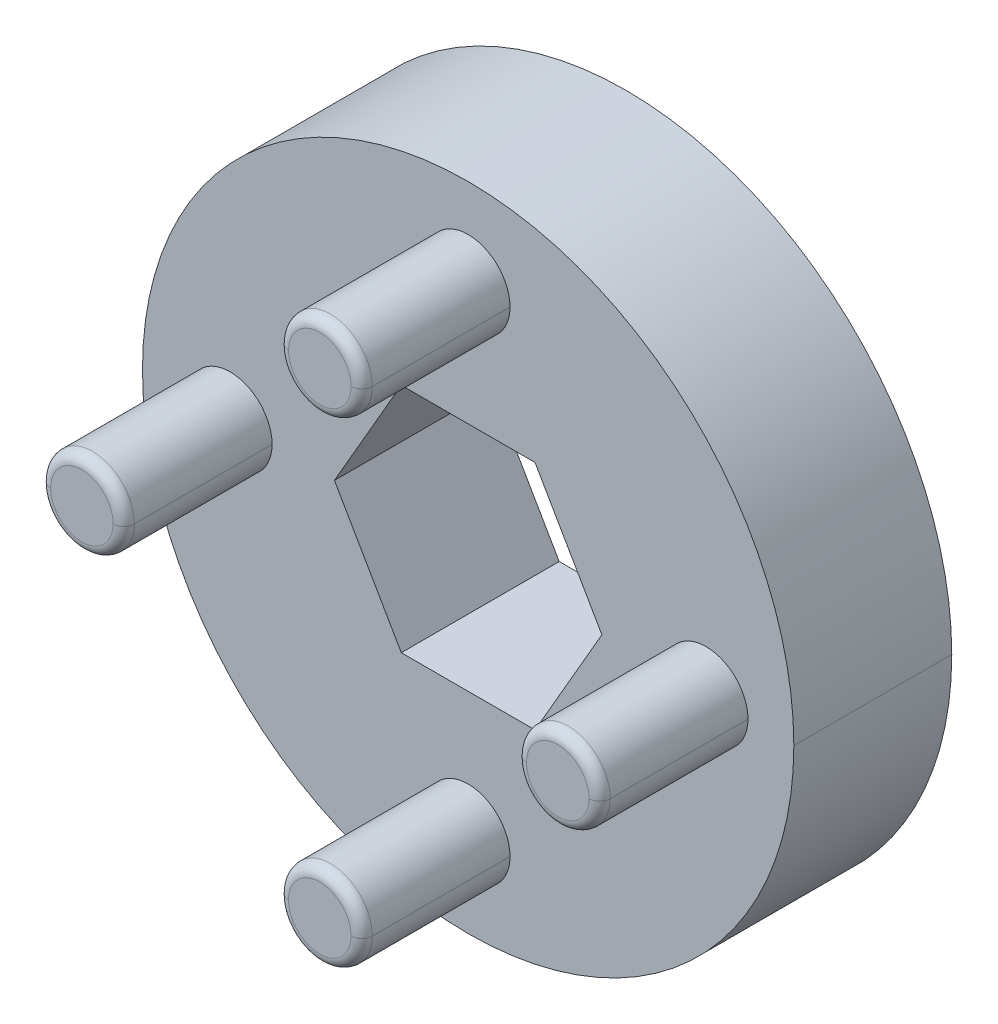
ISO-10303-21;
HEADER;
FILE_DESCRIPTION(('STEP AP214'),'2;1');
FILE_NAME('part.step','',(''),(''),'','','');
FILE_SCHEMA(('AUTOMOTIVE_DESIGN { 1 0 10303 214 1 1 1 1 }'));
ENDSEC;
DATA;
#1=APPLICATION_CONTEXT('core data for automotive mechanical design processes');
#2=APPLICATION_PROTOCOL_DEFINITION('international standard','automotive_design',2000,#1);
#3=PRODUCT_CONTEXT('',#1,'mechanical');
#4=PRODUCT('Part','Part','',(#3));
#5=PRODUCT_RELATED_PRODUCT_CATEGORY('part','',(#4));
#6=PRODUCT_DEFINITION_FORMATION('','',#4);
#7=PRODUCT_DEFINITION_CONTEXT('part definition',#1,'design');
#8=PRODUCT_DEFINITION('design','',#6,#7);
#9=PRODUCT_DEFINITION_SHAPE('','',#8);
#10=(LENGTH_UNIT() NAMED_UNIT(*) SI_UNIT(.MILLI.,.METRE.));
#11=(NAMED_UNIT(*) PLANE_ANGLE_UNIT() SI_UNIT($,.RADIAN.));
#12=(NAMED_UNIT(*) SI_UNIT($,.STERADIAN.) SOLID_ANGLE_UNIT());
#13=UNCERTAINTY_MEASURE_WITH_UNIT(LENGTH_MEASURE(1.E-05),#10,'distance_accuracy_value','');
#14=(GEOMETRIC_REPRESENTATION_CONTEXT(3) GLOBAL_UNCERTAINTY_ASSIGNED_CONTEXT((#13)) GLOBAL_UNIT_ASSIGNED_CONTEXT((#10,
#11,#12)) REPRESENTATION_CONTEXT('',''));
#15=CARTESIAN_POINT('',(0.,0.,0.));
#16=DIRECTION('',(0.,0.,1.));
#17=DIRECTION('',(1.,0.,0.));
#18=AXIS2_PLACEMENT_3D('',#15,#16,#17);
#19=CARTESIAN_POINT('',(-11.3665,1.19057767913881E-13,14.1224));
#20=DIRECTION('',(0.,0.,1.));
#21=DIRECTION('',(1.,0.,0.));
#22=AXIS2_PLACEMENT_3D('',#19,#20,#21);
#23=TOROIDAL_SURFACE('',#22,1.49225,0.508);
#24=CARTESIAN_POINT('',(-11.3665,1.19057767913881E-13,14.1224));
#25=DIRECTION('',(0.,0.,-1.));
#26=DIRECTION('',(1.,0.,0.));
#27=AXIS2_PLACEMENT_3D('',#24,#25,#26);
#28=CIRCLE('',#27,2.00025);
#29=CARTESIAN_POINT('',(-13.36675,1.19057767913881E-13,14.1224));
#30=VERTEX_POINT('',#29);
#31=CARTESIAN_POINT('',(-9.36625,1.19302727889881E-13,14.1224));
#32=VERTEX_POINT('',#31);
#33=EDGE_CURVE('E352',#30,#32,#28,.T.);
#34=ORIENTED_EDGE('',*,*,#33,.F.);
#35=CARTESIAN_POINT('',(-12.85875,1.19240515832484E-13,14.1224));
#36=DIRECTION('',(0.,1.,0.));
#37=DIRECTION('',(-1.,0.,0.));
#38=AXIS2_PLACEMENT_3D('',#35,#36,#37);
#39=CIRCLE('',#38,0.508);
#40=CARTESIAN_POINT('',(-12.85875,1.19271621861183E-13,14.6304));
#41=VERTEX_POINT('',#40);
#42=EDGE_CURVE('E11',#30,#41,#39,.T.);
#43=ORIENTED_EDGE('',*,*,#42,.T.);
#44=CARTESIAN_POINT('',(-11.3665,1.19057767913881E-13,14.6304));
#45=DIRECTION('',(0.,0.,1.));
#46=DIRECTION('',(1.,0.,0.));
#47=AXIS2_PLACEMENT_3D('',#44,#45,#46);
#48=CIRCLE('',#47,1.49225);
#49=CARTESIAN_POINT('',(-9.87425,1.19057767913881E-13,14.6304));
#50=VERTEX_POINT('',#49);
#51=EDGE_CURVE('E332',#50,#41,#48,.T.);
#52=ORIENTED_EDGE('',*,*,#51,.F.);
#53=CARTESIAN_POINT('',(-9.87425,1.19057767913881E-13,14.1224));
#54=DIRECTION('',(0.,-1.,0.));
#55=DIRECTION('',(0.,0.,-1.));
#56=AXIS2_PLACEMENT_3D('',#53,#54,#55);
#57=CIRCLE('',#56,0.508);
#58=EDGE_CURVE('E433',#32,#50,#57,.T.);
#59=ORIENTED_EDGE('',*,*,#58,.F.);
#60=EDGE_LOOP('',(#34,#43,#52,#59));
#61=FACE_BOUND('',#60,.T.);
#62=ADVANCED_FACE('F16',(#61),#23,.T.);
#63=CARTESIAN_POINT('',(0.,-11.3665,14.1224));
#64=DIRECTION('',(0.,0.,1.));
#65=DIRECTION('',(1.,0.,0.));
#66=AXIS2_PLACEMENT_3D('',#63,#64,#65);
#67=TOROIDAL_SURFACE('',#66,1.49225,0.508);
#68=CARTESIAN_POINT('',(0.,-11.3665,14.1224));
#69=DIRECTION('',(0.,0.,-1.));
#70=DIRECTION('',(1.,0.,0.));
#71=AXIS2_PLACEMENT_3D('',#68,#69,#70);
#72=CIRCLE('',#71,2.00025);
#73=CARTESIAN_POINT('',(-2.00025,-11.3665,14.1224));
#74=VERTEX_POINT('',#73);
#75=CARTESIAN_POINT('',(2.00025,-11.3665,14.1224));
#76=VERTEX_POINT('',#75);
#77=EDGE_CURVE('E287',#74,#76,#72,.T.);
#78=ORIENTED_EDGE('',*,*,#77,.F.);
#79=CARTESIAN_POINT('',(-1.49225,-11.3665,14.1224));
#80=DIRECTION('',(0.,1.,0.));
#81=DIRECTION('',(-1.,0.,0.));
#82=AXIS2_PLACEMENT_3D('',#79,#80,#81);
#83=CIRCLE('',#82,0.508);
#84=CARTESIAN_POINT('',(-1.49225,-11.3665,14.6304));
#85=VERTEX_POINT('',#84);
#86=EDGE_CURVE('E27',#74,#85,#83,.T.);
#87=ORIENTED_EDGE('',*,*,#86,.T.);
#88=CARTESIAN_POINT('',(0.,-11.3665,14.6304));
#89=DIRECTION('',(0.,0.,1.));
#90=DIRECTION('',(1.,0.,0.));
#91=AXIS2_PLACEMENT_3D('',#88,#89,#90);
#92=CIRCLE('',#91,1.49225);
#93=CARTESIAN_POINT('',(1.49225,-11.3665,14.6304));
#94=VERTEX_POINT('',#93);
#95=EDGE_CURVE('E366',#94,#85,#92,.T.);
#96=ORIENTED_EDGE('',*,*,#95,.F.);
#97=CARTESIAN_POINT('',(1.49225,-11.3665,14.1224));
#98=DIRECTION('',(0.,-1.,0.));
#99=DIRECTION('',(0.,0.,-1.));
#100=AXIS2_PLACEMENT_3D('',#97,#98,#99);
#101=CIRCLE('',#100,0.508);
#102=EDGE_CURVE('E430',#76,#94,#101,.T.);
#103=ORIENTED_EDGE('',*,*,#102,.F.);
#104=EDGE_LOOP('',(#78,#87,#96,#103));
#105=FACE_BOUND('',#104,.T.);
#106=ADVANCED_FACE('F689',(#105),#67,.T.);
#107=CARTESIAN_POINT('',(11.3665,0.,14.1224));
#108=DIRECTION('',(0.,0.,1.));
#109=DIRECTION('',(1.,0.,0.));
#110=AXIS2_PLACEMENT_3D('',#107,#108,#109);
#111=TOROIDAL_SURFACE('',#110,1.49225,0.508);
#112=CARTESIAN_POINT('',(11.3665,0.,14.1224));
#113=DIRECTION('',(0.,0.,-1.));
#114=DIRECTION('',(1.,0.,0.));
#115=AXIS2_PLACEMENT_3D('',#112,#113,#114);
#116=CIRCLE('',#115,2.00025);
#117=CARTESIAN_POINT('',(9.36625,0.,14.1224));
#118=VERTEX_POINT('',#117);
#119=CARTESIAN_POINT('',(13.36675,0.,14.1224));
#120=VERTEX_POINT('',#119);
#121=EDGE_CURVE('E342',#118,#120,#116,.T.);
#122=ORIENTED_EDGE('',*,*,#121,.F.);
#123=CARTESIAN_POINT('',(9.87425,0.,14.1224));
#124=DIRECTION('',(0.,1.,0.));
#125=DIRECTION('',(-1.,0.,0.));
#126=AXIS2_PLACEMENT_3D('',#123,#124,#125);
#127=CIRCLE('',#126,0.508);
#128=CARTESIAN_POINT('',(9.87425,0.,14.6304));
#129=VERTEX_POINT('',#128);
#130=EDGE_CURVE('E376',#118,#129,#127,.T.);
#131=ORIENTED_EDGE('',*,*,#130,.T.);
#132=CARTESIAN_POINT('',(11.3665,0.,14.6304));
#133=DIRECTION('',(0.,0.,1.));
#134=DIRECTION('',(1.,0.,0.));
#135=AXIS2_PLACEMENT_3D('',#132,#133,#134);
#136=CIRCLE('',#135,1.49225);
#137=CARTESIAN_POINT('',(12.85875,0.,14.6304));
#138=VERTEX_POINT('',#137);
#139=EDGE_CURVE('E270',#138,#129,#136,.T.);
#140=ORIENTED_EDGE('',*,*,#139,.F.);
#141=CARTESIAN_POINT('',(12.85875,0.,14.1224));
#142=DIRECTION('',(0.,-1.,0.));
#143=DIRECTION('',(0.,0.,-1.));
#144=AXIS2_PLACEMENT_3D('',#141,#142,#143);
#145=CIRCLE('',#144,0.508);
#146=EDGE_CURVE('E333',#120,#138,#145,.T.);
#147=ORIENTED_EDGE('',*,*,#146,.F.);
#148=EDGE_LOOP('',(#122,#131,#140,#147));
#149=FACE_BOUND('',#148,.T.);
#150=ADVANCED_FACE('F684',(#149),#111,.T.);
#151=CARTESIAN_POINT('',(-11.3665,1.19057767913881E-13,14.6304));
#152=DIRECTION('',(0.,0.,-1.));
#153=DIRECTION('',(-1.,0.,0.));
#154=AXIS2_PLACEMENT_3D('',#151,#152,#153);
#155=CYLINDRICAL_SURFACE('',#154,2.00025);
#156=ORIENTED_EDGE('',*,*,#33,.T.);
#157=DIRECTION('',(0.,0.,-1.));
#158=VECTOR('',#157,1.);
#159=CARTESIAN_POINT('',(-9.36625,1.19302727889881E-13,14.6304));
#160=LINE('',#159,#158);
#161=CARTESIAN_POINT('',(-9.36625,1.19302727889881E-13,7.5438));
#162=VERTEX_POINT('',#161);
#163=EDGE_CURVE('E286',#32,#162,#160,.T.);
#164=ORIENTED_EDGE('',*,*,#163,.T.);
#165=CARTESIAN_POINT('',(-11.3665,1.19057767913881E-13,7.5438));
#166=DIRECTION('',(0.,0.,1.));
#167=DIRECTION('',(0.,1.,0.));
#168=AXIS2_PLACEMENT_3D('',#165,#166,#167);
#169=CIRCLE('',#168,2.00025);
#170=CARTESIAN_POINT('',(-13.36675,1.19057767913881E-13,7.5438));
#171=VERTEX_POINT('',#170);
#172=EDGE_CURVE('E283',#162,#171,#169,.T.);
#173=ORIENTED_EDGE('',*,*,#172,.T.);
#174=DIRECTION('',(0.,0.,-1.));
#175=VECTOR('',#174,1.);
#176=CARTESIAN_POINT('',(-13.36675,1.19057767913881E-13,14.6304));
#177=LINE('',#176,#175);
#178=EDGE_CURVE('E42',#30,#171,#177,.T.);
#179=ORIENTED_EDGE('',*,*,#178,.F.);
#180=EDGE_LOOP('',(#156,#164,#173,#179));
#181=FACE_BOUND('',#180,.T.);
#182=ADVANCED_FACE('F688',(#181),#155,.T.);
#183=CARTESIAN_POINT('',(0.,-11.3665,14.6304));
#184=DIRECTION('',(0.,0.,-1.));
#185=DIRECTION('',(-1.,0.,0.));
#186=AXIS2_PLACEMENT_3D('',#183,#184,#185);
#187=CYLINDRICAL_SURFACE('',#186,2.00025);
#188=ORIENTED_EDGE('',*,*,#77,.T.);
#189=DIRECTION('',(0.,0.,-1.));
#190=VECTOR('',#189,1.);
#191=CARTESIAN_POINT('',(2.00025,-11.3665,14.6304));
#192=LINE('',#191,#190);
#193=CARTESIAN_POINT('',(2.00025,-11.3665,7.5438));
#194=VERTEX_POINT('',#193);
#195=EDGE_CURVE('E341',#76,#194,#192,.T.);
#196=ORIENTED_EDGE('',*,*,#195,.T.);
#197=CARTESIAN_POINT('',(0.,-11.3665,7.5438));
#198=DIRECTION('',(0.,0.,1.));
#199=DIRECTION('',(-1.,0.,0.));
#200=AXIS2_PLACEMENT_3D('',#197,#198,#199);
#201=CIRCLE('',#200,2.00025);
#202=CARTESIAN_POINT('',(-2.00025,-11.3665,7.5438));
#203=VERTEX_POINT('',#202);
#204=EDGE_CURVE('E337',#194,#203,#201,.T.);
#205=ORIENTED_EDGE('',*,*,#204,.T.);
#206=DIRECTION('',(0.,0.,-1.));
#207=VECTOR('',#206,1.);
#208=CARTESIAN_POINT('',(-2.00025,-11.3665,14.6304));
#209=LINE('',#208,#207);
#210=EDGE_CURVE('E368',#74,#203,#209,.T.);
#211=ORIENTED_EDGE('',*,*,#210,.F.);
#212=EDGE_LOOP('',(#188,#196,#205,#211));
#213=FACE_BOUND('',#212,.T.);
#214=ADVANCED_FACE('F751',(#213),#187,.T.);
#215=CARTESIAN_POINT('',(11.3665,0.,14.6304));
#216=DIRECTION('',(0.,0.,-1.));
#217=DIRECTION('',(-1.,0.,0.));
#218=AXIS2_PLACEMENT_3D('',#215,#216,#217);
#219=CYLINDRICAL_SURFACE('',#218,2.00025);
#220=ORIENTED_EDGE('',*,*,#121,.T.);
#221=DIRECTION('',(0.,0.,-1.));
#222=VECTOR('',#221,1.);
#223=CARTESIAN_POINT('',(13.36675,0.,14.6304));
#224=LINE('',#223,#222);
#225=CARTESIAN_POINT('',(13.36675,0.,7.5438));
#226=VERTEX_POINT('',#225);
#227=EDGE_CURVE('E361',#120,#226,#224,.T.);
#228=ORIENTED_EDGE('',*,*,#227,.T.);
#229=CARTESIAN_POINT('',(11.3665,0.,7.5438));
#230=DIRECTION('',(0.,0.,1.));
#231=DIRECTION('',(0.,-1.,0.));
#232=AXIS2_PLACEMENT_3D('',#229,#230,#231);
#233=CIRCLE('',#232,2.00025);
#234=CARTESIAN_POINT('',(9.36625,0.,7.5438));
#235=VERTEX_POINT('',#234);
#236=EDGE_CURVE('E358',#226,#235,#233,.T.);
#237=ORIENTED_EDGE('',*,*,#236,.T.);
#238=DIRECTION('',(0.,0.,-1.));
#239=VECTOR('',#238,1.);
#240=CARTESIAN_POINT('',(9.36625,0.,14.6304));
#241=LINE('',#240,#239);
#242=EDGE_CURVE('E264',#118,#235,#241,.T.);
#243=ORIENTED_EDGE('',*,*,#242,.F.);
#244=EDGE_LOOP('',(#220,#228,#237,#243));
#245=FACE_BOUND('',#244,.T.);
#246=ADVANCED_FACE('F755',(#245),#219,.T.);
#247=CARTESIAN_POINT('',(0.,11.3665,14.1224));
#248=DIRECTION('',(0.,0.,1.));
#249=DIRECTION('',(1.,0.,0.));
#250=AXIS2_PLACEMENT_3D('',#247,#248,#249);
#251=TOROIDAL_SURFACE('',#250,1.49225,0.508);
#252=CARTESIAN_POINT('',(0.,11.3665,14.1224));
#253=DIRECTION('',(0.,0.,-1.));
#254=DIRECTION('',(1.,0.,0.));
#255=AXIS2_PLACEMENT_3D('',#252,#253,#254);
#256=CIRCLE('',#255,2.00025);
#257=CARTESIAN_POINT('',(-2.00025,11.3665,14.1224));
#258=VERTEX_POINT('',#257);
#259=CARTESIAN_POINT('',(2.00025,11.3665,14.1224));
#260=VERTEX_POINT('',#259);
#261=EDGE_CURVE('E279',#258,#260,#256,.T.);
#262=ORIENTED_EDGE('',*,*,#261,.F.);
#263=CARTESIAN_POINT('',(-1.49225,11.3665,14.1224));
#264=DIRECTION('',(0.,1.,0.));
#265=DIRECTION('',(-1.,0.,0.));
#266=AXIS2_PLACEMENT_3D('',#263,#264,#265);
#267=CIRCLE('',#266,0.508);
#268=CARTESIAN_POINT('',(-1.49225,11.3665,14.6304));
#269=VERTEX_POINT('',#268);
#270=EDGE_CURVE('E318',#258,#269,#267,.T.);
#271=ORIENTED_EDGE('',*,*,#270,.T.);
#272=CARTESIAN_POINT('',(0.,11.3665,14.6304));
#273=DIRECTION('',(0.,0.,1.));
#274=DIRECTION('',(1.,0.,0.));
#275=AXIS2_PLACEMENT_3D('',#272,#273,#274);
#276=CIRCLE('',#275,1.49225);
#277=CARTESIAN_POINT('',(1.49225,11.3665,14.6304));
#278=VERTEX_POINT('',#277);
#279=EDGE_CURVE('E122',#278,#269,#276,.T.);
#280=ORIENTED_EDGE('',*,*,#279,.F.);
#281=CARTESIAN_POINT('',(1.49225,11.3665,14.1224));
#282=DIRECTION('',(0.,-1.,0.));
#283=DIRECTION('',(0.,0.,-1.));
#284=AXIS2_PLACEMENT_3D('',#281,#282,#283);
#285=CIRCLE('',#284,0.508);
#286=EDGE_CURVE('E250',#260,#278,#285,.T.);
#287=ORIENTED_EDGE('',*,*,#286,.F.);
#288=EDGE_LOOP('',(#262,#271,#280,#287));
#289=FACE_BOUND('',#288,.T.);
#290=ADVANCED_FACE('F467',(#289),#251,.T.);
#291=CARTESIAN_POINT('',(0.,11.3665,14.6304));
#292=DIRECTION('',(0.,0.,-1.));
#293=DIRECTION('',(-1.,0.,0.));
#294=AXIS2_PLACEMENT_3D('',#291,#292,#293);
#295=CYLINDRICAL_SURFACE('',#294,2.00025);
#296=ORIENTED_EDGE('',*,*,#261,.T.);
#297=DIRECTION('',(0.,0.,-1.));
#298=VECTOR('',#297,1.);
#299=CARTESIAN_POINT('',(2.00025,11.3665,14.6304));
#300=LINE('',#299,#298);
#301=CARTESIAN_POINT('',(2.00025,11.3665,7.5438));
#302=VERTEX_POINT('',#301);
#303=EDGE_CURVE('E275',#260,#302,#300,.T.);
#304=ORIENTED_EDGE('',*,*,#303,.T.);
#305=CARTESIAN_POINT('',(0.,11.3665,7.5438));
#306=DIRECTION('',(0.,0.,1.));
#307=DIRECTION('',(1.,0.,0.));
#308=AXIS2_PLACEMENT_3D('',#305,#306,#307);
#309=CIRCLE('',#308,2.00025);
#310=CARTESIAN_POINT('',(-2.00025,11.3665,7.5438));
#311=VERTEX_POINT('',#310);
#312=EDGE_CURVE('E280',#302,#311,#309,.T.);
#313=ORIENTED_EDGE('',*,*,#312,.T.);
#314=DIRECTION('',(0.,0.,-1.));
#315=VECTOR('',#314,1.);
#316=CARTESIAN_POINT('',(-2.00025,11.3665,14.6304));
#317=LINE('',#316,#315);
#318=EDGE_CURVE('E105',#258,#311,#317,.T.);
#319=ORIENTED_EDGE('',*,*,#318,.F.);
#320=EDGE_LOOP('',(#296,#304,#313,#319));
#321=FACE_BOUND('',#320,.T.);
#322=ADVANCED_FACE('F468',(#321),#295,.T.);
#323=CARTESIAN_POINT('',(0.,0.,7.5438));
#324=DIRECTION('',(0.,0.,-1.));
#325=DIRECTION('',(-1.,0.,0.));
#326=AXIS2_PLACEMENT_3D('',#323,#324,#325);
#327=CYLINDRICAL_SURFACE('',#326,15.5575);
#328=CARTESIAN_POINT('',(0.,0.,7.5438));
#329=DIRECTION('',(0.,0.,1.));
#330=DIRECTION('',(1.,0.,0.));
#331=AXIS2_PLACEMENT_3D('',#328,#329,#330);
#332=CIRCLE('',#331,15.5575);
#333=CARTESIAN_POINT('',(15.5575,0.,7.5438));
#334=VERTEX_POINT('',#333);
#335=CARTESIAN_POINT('',(-15.5575,0.,7.5438));
#336=VERTEX_POINT('',#335);
#337=EDGE_CURVE('E293',#334,#336,#332,.T.);
#338=ORIENTED_EDGE('',*,*,#337,.F.);
#339=DIRECTION('',(0.,0.,-1.));
#340=VECTOR('',#339,1.);
#341=CARTESIAN_POINT('',(15.5575,0.,7.5438));
#342=LINE('',#341,#340);
#343=CARTESIAN_POINT('',(15.5575,0.,0.));
#344=VERTEX_POINT('',#343);
#345=EDGE_CURVE('E288',#334,#344,#342,.T.);
#346=ORIENTED_EDGE('',*,*,#345,.T.);
#347=CARTESIAN_POINT('',(0.,0.,0.));
#348=DIRECTION('',(0.,0.,1.));
#349=DIRECTION('',(1.,0.,0.));
#350=AXIS2_PLACEMENT_3D('',#347,#348,#349);
#351=CIRCLE('',#350,15.5575);
#352=CARTESIAN_POINT('',(-15.5575,0.,0.));
#353=VERTEX_POINT('',#352);
#354=EDGE_CURVE('E292',#344,#353,#351,.T.);
#355=ORIENTED_EDGE('',*,*,#354,.T.);
#356=DIRECTION('',(0.,0.,-1.));
#357=VECTOR('',#356,1.);
#358=CARTESIAN_POINT('',(-15.5575,0.,7.5438));
#359=LINE('',#358,#357);
#360=EDGE_CURVE('E259',#336,#353,#359,.T.);
#361=ORIENTED_EDGE('',*,*,#360,.F.);
#362=EDGE_LOOP('',(#338,#346,#355,#361));
#363=FACE_BOUND('',#362,.T.);
#364=ADVANCED_FACE('F771',(#363),#327,.T.);
#365=CARTESIAN_POINT('',(0.,0.,7.5438));
#366=DIRECTION('',(0.,0.,1.));
#367=DIRECTION('',(1.,0.,0.));
#368=AXIS2_PLACEMENT_3D('',#365,#366,#367);
#369=PLANE('',#368);
#370=CARTESIAN_POINT('',(0.,0.,7.5438));
#371=DIRECTION('',(0.,0.,1.));
#372=DIRECTION('',(1.,0.,0.));
#373=AXIS2_PLACEMENT_3D('',#370,#371,#372);
#374=CIRCLE('',#373,15.5575);
#375=EDGE_CURVE('E296',#336,#334,#374,.T.);
#376=ORIENTED_EDGE('',*,*,#375,.T.);
#377=ORIENTED_EDGE('',*,*,#337,.T.);
#378=EDGE_LOOP('',(#376,#377));
#379=FACE_BOUND('',#378,.T.);
#380=CARTESIAN_POINT('',(-11.3665,1.19057767913881E-13,7.5438));
#381=DIRECTION('',(0.,0.,1.));
#382=DIRECTION('',(0.,1.,0.));
#383=AXIS2_PLACEMENT_3D('',#380,#381,#382);
#384=CIRCLE('',#383,2.00025);
#385=EDGE_CURVE('E315',#171,#162,#384,.T.);
#386=ORIENTED_EDGE('',*,*,#385,.F.);
#387=ORIENTED_EDGE('',*,*,#172,.F.);
#388=EDGE_LOOP('',(#386,#387));
#389=FACE_BOUND('',#388,.T.);
#390=CARTESIAN_POINT('',(0.,-11.3665,7.5438));
#391=DIRECTION('',(0.,0.,1.));
#392=DIRECTION('',(-1.,0.,0.));
#393=AXIS2_PLACEMENT_3D('',#390,#391,#392);
#394=CIRCLE('',#393,2.00025);
#395=EDGE_CURVE('E372',#203,#194,#394,.T.);
#396=ORIENTED_EDGE('',*,*,#395,.F.);
#397=ORIENTED_EDGE('',*,*,#204,.F.);
#398=EDGE_LOOP('',(#396,#397));
#399=FACE_BOUND('',#398,.T.);
#400=CARTESIAN_POINT('',(11.3665,0.,7.5438));
#401=DIRECTION('',(0.,0.,1.));
#402=DIRECTION('',(0.,-1.,0.));
#403=AXIS2_PLACEMENT_3D('',#400,#401,#402);
#404=CIRCLE('',#403,2.00025);
#405=EDGE_CURVE('E273',#235,#226,#404,.T.);
#406=ORIENTED_EDGE('',*,*,#405,.F.);
#407=ORIENTED_EDGE('',*,*,#236,.F.);
#408=EDGE_LOOP('',(#406,#407));
#409=FACE_BOUND('',#408,.T.);
#410=CARTESIAN_POINT('',(0.,11.3665,7.5438));
#411=DIRECTION('',(0.,0.,1.));
#412=DIRECTION('',(1.,0.,0.));
#413=AXIS2_PLACEMENT_3D('',#410,#411,#412);
#414=CIRCLE('',#413,2.00025);
#415=EDGE_CURVE('E243',#311,#302,#414,.T.);
#416=ORIENTED_EDGE('',*,*,#415,.F.);
#417=ORIENTED_EDGE('',*,*,#312,.F.);
#418=EDGE_LOOP('',(#416,#417));
#419=FACE_BOUND('',#418,.T.);
#420=DIRECTION('',(-0.5,0.866025403784439,0.));
#421=VECTOR('',#420,1.);
#422=CARTESIAN_POINT('',(6.3881,0.,7.5438));
#423=LINE('',#422,#421);
#424=CARTESIAN_POINT('',(6.3881,0.,7.5438));
#425=VERTEX_POINT('',#424);
#426=CARTESIAN_POINT('',(3.19405,5.53225688191537,7.5438));
#427=VERTEX_POINT('',#426);
#428=EDGE_CURVE('E245',#425,#427,#423,.T.);
#429=ORIENTED_EDGE('',*,*,#428,.F.);
#430=DIRECTION('',(0.5,0.866025403784439,0.));
#431=VECTOR('',#430,1.);
#432=CARTESIAN_POINT('',(3.19405,-5.53225688191537,7.5438));
#433=LINE('',#432,#431);
#434=CARTESIAN_POINT('',(3.19405,-5.53225688191537,7.5438));
#435=VERTEX_POINT('',#434);
#436=EDGE_CURVE('E260',#435,#425,#433,.T.);
#437=ORIENTED_EDGE('',*,*,#436,.F.);
#438=DIRECTION('',(1.,0.,0.));
#439=VECTOR('',#438,1.);
#440=CARTESIAN_POINT('',(-3.19405,-5.53225688191537,7.5438));
#441=LINE('',#440,#439);
#442=CARTESIAN_POINT('',(-3.19405,-5.53225688191537,7.5438));
#443=VERTEX_POINT('',#442);
#444=EDGE_CURVE('E214',#443,#435,#441,.T.);
#445=ORIENTED_EDGE('',*,*,#444,.F.);
#446=DIRECTION('',(0.5,-0.866025403784438,0.));
#447=VECTOR('',#446,1.);
#448=CARTESIAN_POINT('',(-6.3881,0.,7.5438));
#449=LINE('',#448,#447);
#450=CARTESIAN_POINT('',(-6.3881,0.,7.5438));
#451=VERTEX_POINT('',#450);
#452=EDGE_CURVE('E208',#451,#443,#449,.T.);
#453=ORIENTED_EDGE('',*,*,#452,.F.);
#454=DIRECTION('',(-0.5,-0.866025403784439,0.));
#455=VECTOR('',#454,1.);
#456=CARTESIAN_POINT('',(-3.19405,5.53225688191537,7.5438));
#457=LINE('',#456,#455);
#458=CARTESIAN_POINT('',(-3.19405,5.53225688191537,7.5438));
#459=VERTEX_POINT('',#458);
#460=EDGE_CURVE('E211',#459,#451,#457,.T.);
#461=ORIENTED_EDGE('',*,*,#460,.F.);
#462=DIRECTION('',(-1.,0.,0.));
#463=VECTOR('',#462,1.);
#464=CARTESIAN_POINT('',(3.19405,5.53225688191537,7.5438));
#465=LINE('',#464,#463);
#466=EDGE_CURVE('E321',#427,#459,#465,.T.);
#467=ORIENTED_EDGE('',*,*,#466,.F.);
#468=EDGE_LOOP('',(#429,#437,#445,#453,#461,#467));
#469=FACE_BOUND('',#468,.T.);
#470=ADVANCED_FACE('F210',(#379,#389,#399,#409,#419,#469),#369,.T.);
#471=CARTESIAN_POINT('',(0.,0.,0.));
#472=DIRECTION('',(0.,0.,1.));
#473=DIRECTION('',(1.,0.,0.));
#474=AXIS2_PLACEMENT_3D('',#471,#472,#473);
#475=PLANE('',#474);
#476=CARTESIAN_POINT('',(0.,0.,0.));
#477=DIRECTION('',(0.,0.,1.));
#478=DIRECTION('',(1.,0.,0.));
#479=AXIS2_PLACEMENT_3D('',#476,#477,#478);
#480=CIRCLE('',#479,15.5575);
#481=EDGE_CURVE('E255',#353,#344,#480,.T.);
#482=ORIENTED_EDGE('',*,*,#481,.F.);
#483=ORIENTED_EDGE('',*,*,#354,.F.);
#484=EDGE_LOOP('',(#482,#483));
#485=FACE_BOUND('',#484,.T.);
#486=DIRECTION('',(0.5,0.866025403784439,0.));
#487=VECTOR('',#486,1.);
#488=CARTESIAN_POINT('',(3.19405,-5.53225688191537,0.));
#489=LINE('',#488,#487);
#490=CARTESIAN_POINT('',(3.19405,-5.53225688191537,0.));
#491=VERTEX_POINT('',#490);
#492=CARTESIAN_POINT('',(6.3881,0.,0.));
#493=VERTEX_POINT('',#492);
#494=EDGE_CURVE('E297',#491,#493,#489,.T.);
#495=ORIENTED_EDGE('',*,*,#494,.T.);
#496=DIRECTION('',(-0.5,0.866025403784439,0.));
#497=VECTOR('',#496,1.);
#498=CARTESIAN_POINT('',(6.3881,0.,0.));
#499=LINE('',#498,#497);
#500=CARTESIAN_POINT('',(3.19405,5.53225688191537,0.));
#501=VERTEX_POINT('',#500);
#502=EDGE_CURVE('E20',#493,#501,#499,.T.);
#503=ORIENTED_EDGE('',*,*,#502,.T.);
#504=DIRECTION('',(-1.,0.,0.));
#505=VECTOR('',#504,1.);
#506=CARTESIAN_POINT('',(3.19405,5.53225688191537,0.));
#507=LINE('',#506,#505);
#508=CARTESIAN_POINT('',(-3.19405,5.53225688191537,0.));
#509=VERTEX_POINT('',#508);
#510=EDGE_CURVE('E478',#501,#509,#507,.T.);
#511=ORIENTED_EDGE('',*,*,#510,.T.);
#512=DIRECTION('',(-0.5,-0.866025403784439,0.));
#513=VECTOR('',#512,1.);
#514=CARTESIAN_POINT('',(-3.19405,5.53225688191537,0.));
#515=LINE('',#514,#513);
#516=CARTESIAN_POINT('',(-6.3881,0.,0.));
#517=VERTEX_POINT('',#516);
#518=EDGE_CURVE('E426',#509,#517,#515,.T.);
#519=ORIENTED_EDGE('',*,*,#518,.T.);
#520=DIRECTION('',(0.5,-0.866025403784438,0.));
#521=VECTOR('',#520,1.);
#522=CARTESIAN_POINT('',(-6.3881,0.,0.));
#523=LINE('',#522,#521);
#524=CARTESIAN_POINT('',(-3.19405,-5.53225688191537,0.));
#525=VERTEX_POINT('',#524);
#526=EDGE_CURVE('E233',#517,#525,#523,.T.);
#527=ORIENTED_EDGE('',*,*,#526,.T.);
#528=DIRECTION('',(1.,0.,0.));
#529=VECTOR('',#528,1.);
#530=CARTESIAN_POINT('',(-3.19405,-5.53225688191537,0.));
#531=LINE('',#530,#529);
#532=EDGE_CURVE('E334',#525,#491,#531,.T.);
#533=ORIENTED_EDGE('',*,*,#532,.T.);
#534=EDGE_LOOP('',(#495,#503,#511,#519,#527,#533));
#535=FACE_BOUND('',#534,.T.);
#536=ADVANCED_FACE('F487',(#485,#535),#475,.F.);
#537=CARTESIAN_POINT('',(0.,0.,7.5438));
#538=DIRECTION('',(0.,0.,-1.));
#539=DIRECTION('',(-1.,0.,0.));
#540=AXIS2_PLACEMENT_3D('',#537,#538,#539);
#541=CYLINDRICAL_SURFACE('',#540,15.5575);
#542=ORIENTED_EDGE('',*,*,#345,.F.);
#543=ORIENTED_EDGE('',*,*,#375,.F.);
#544=ORIENTED_EDGE('',*,*,#360,.T.);
#545=ORIENTED_EDGE('',*,*,#481,.T.);
#546=EDGE_LOOP('',(#542,#543,#544,#545));
#547=FACE_BOUND('',#546,.T.);
#548=ADVANCED_FACE('F695',(#547),#541,.T.);
#549=CARTESIAN_POINT('',(3.19405,-5.53225688191537,7.5438));
#550=DIRECTION('',(-0.866025403784439,0.5,0.));
#551=DIRECTION('',(0.,0.,1.));
#552=AXIS2_PLACEMENT_3D('',#549,#550,#551);
#553=PLANE('',#552);
#554=ORIENTED_EDGE('',*,*,#494,.F.);
#555=DIRECTION('',(0.,0.,-1.));
#556=VECTOR('',#555,1.);
#557=CARTESIAN_POINT('',(3.19405,-5.53225688191537,7.5438));
#558=LINE('',#557,#556);
#559=EDGE_CURVE('E265',#435,#491,#558,.T.);
#560=ORIENTED_EDGE('',*,*,#559,.F.);
#561=ORIENTED_EDGE('',*,*,#436,.T.);
#562=DIRECTION('',(0.,0.,-1.));
#563=VECTOR('',#562,1.);
#564=CARTESIAN_POINT('',(6.3881,0.,7.5438));
#565=LINE('',#564,#563);
#566=EDGE_CURVE('E248',#425,#493,#565,.T.);
#567=ORIENTED_EDGE('',*,*,#566,.T.);
#568=EDGE_LOOP('',(#554,#560,#561,#567));
#569=FACE_BOUND('',#568,.T.);
#570=ADVANCED_FACE('F497',(#569),#553,.T.);
#571=CARTESIAN_POINT('',(6.3881,0.,7.5438));
#572=DIRECTION('',(-0.866025403784439,-0.5,0.));
#573=DIRECTION('',(-0.5,0.866025403784439,0.));
#574=AXIS2_PLACEMENT_3D('',#571,#572,#573);
#575=PLANE('',#574);
#576=ORIENTED_EDGE('',*,*,#502,.F.);
#577=ORIENTED_EDGE('',*,*,#566,.F.);
#578=ORIENTED_EDGE('',*,*,#428,.T.);
#579=DIRECTION('',(0.,0.,-1.));
#580=VECTOR('',#579,1.);
#581=CARTESIAN_POINT('',(3.19405,5.53225688191537,7.5438));
#582=LINE('',#581,#580);
#583=EDGE_CURVE('E249',#427,#501,#582,.T.);
#584=ORIENTED_EDGE('',*,*,#583,.T.);
#585=EDGE_LOOP('',(#576,#577,#578,#584));
#586=FACE_BOUND('',#585,.T.);
#587=ADVANCED_FACE('F494',(#586),#575,.T.);
#588=CARTESIAN_POINT('',(3.19405,5.53225688191537,7.5438));
#589=DIRECTION('',(0.,-1.,0.));
#590=DIRECTION('',(-1.,0.,0.));
#591=AXIS2_PLACEMENT_3D('',#588,#589,#590);
#592=PLANE('',#591);
#593=ORIENTED_EDGE('',*,*,#510,.F.);
#594=ORIENTED_EDGE('',*,*,#583,.F.);
#595=ORIENTED_EDGE('',*,*,#466,.T.);
#596=DIRECTION('',(0.,0.,-1.));
#597=VECTOR('',#596,1.);
#598=CARTESIAN_POINT('',(-3.19405,5.53225688191537,7.5438));
#599=LINE('',#598,#597);
#600=EDGE_CURVE('E228',#459,#509,#599,.T.);
#601=ORIENTED_EDGE('',*,*,#600,.T.);
#602=EDGE_LOOP('',(#593,#594,#595,#601));
#603=FACE_BOUND('',#602,.T.);
#604=ADVANCED_FACE('F491',(#603),#592,.T.);
#605=CARTESIAN_POINT('',(-3.19405,5.53225688191537,7.5438));
#606=DIRECTION('',(0.866025403784439,-0.5,0.));
#607=DIRECTION('',(0.,0.,-1.));
#608=AXIS2_PLACEMENT_3D('',#605,#606,#607);
#609=PLANE('',#608);
#610=ORIENTED_EDGE('',*,*,#518,.F.);
#611=ORIENTED_EDGE('',*,*,#600,.F.);
#612=ORIENTED_EDGE('',*,*,#460,.T.);
#613=DIRECTION('',(0.,0.,-1.));
#614=VECTOR('',#613,1.);
#615=CARTESIAN_POINT('',(-6.3881,0.,7.5438));
#616=LINE('',#615,#614);
#617=EDGE_CURVE('E220',#451,#517,#616,.T.);
#618=ORIENTED_EDGE('',*,*,#617,.T.);
#619=EDGE_LOOP('',(#610,#611,#612,#618));
#620=FACE_BOUND('',#619,.T.);
#621=ADVANCED_FACE('F226',(#620),#609,.T.);
#622=CARTESIAN_POINT('',(-6.3881,0.,7.5438));
#623=DIRECTION('',(0.866025403784438,0.5,0.));
#624=DIRECTION('',(0.,0.,-1.));
#625=AXIS2_PLACEMENT_3D('',#622,#623,#624);
#626=PLANE('',#625);
#627=ORIENTED_EDGE('',*,*,#526,.F.);
#628=ORIENTED_EDGE('',*,*,#617,.F.);
#629=ORIENTED_EDGE('',*,*,#452,.T.);
#630=DIRECTION('',(0.,0.,-1.));
#631=VECTOR('',#630,1.);
#632=CARTESIAN_POINT('',(-3.19405,-5.53225688191537,7.5438));
#633=LINE('',#632,#631);
#634=EDGE_CURVE('E221',#443,#525,#633,.T.);
#635=ORIENTED_EDGE('',*,*,#634,.T.);
#636=EDGE_LOOP('',(#627,#628,#629,#635));
#637=FACE_BOUND('',#636,.T.);
#638=ADVANCED_FACE('F231',(#637),#626,.T.);
#639=CARTESIAN_POINT('',(-3.19405,-5.53225688191537,7.5438));
#640=DIRECTION('',(0.,1.,0.));
#641=DIRECTION('',(1.,0.,0.));
#642=AXIS2_PLACEMENT_3D('',#639,#640,#641);
#643=PLANE('',#642);
#644=ORIENTED_EDGE('',*,*,#532,.F.);
#645=ORIENTED_EDGE('',*,*,#634,.F.);
#646=ORIENTED_EDGE('',*,*,#444,.T.);
#647=ORIENTED_EDGE('',*,*,#559,.T.);
#648=EDGE_LOOP('',(#644,#645,#646,#647));
#649=FACE_BOUND('',#648,.T.);
#650=ADVANCED_FACE('F501',(#649),#643,.T.);
#651=CARTESIAN_POINT('',(0.,11.3665,14.6304));
#652=DIRECTION('',(0.,0.,-1.));
#653=DIRECTION('',(-1.,0.,0.));
#654=AXIS2_PLACEMENT_3D('',#651,#652,#653);
#655=CYLINDRICAL_SURFACE('',#654,2.00025);
#656=ORIENTED_EDGE('',*,*,#303,.F.);
#657=CARTESIAN_POINT('',(0.,11.3665,14.1224));
#658=DIRECTION('',(0.,0.,-1.));
#659=DIRECTION('',(1.,0.,0.));
#660=AXIS2_PLACEMENT_3D('',#657,#658,#659);
#661=CIRCLE('',#660,2.00025);
#662=EDGE_CURVE('E269',#260,#258,#661,.T.);
#663=ORIENTED_EDGE('',*,*,#662,.T.);
#664=ORIENTED_EDGE('',*,*,#318,.T.);
#665=ORIENTED_EDGE('',*,*,#415,.T.);
#666=EDGE_LOOP('',(#656,#663,#664,#665));
#667=FACE_BOUND('',#666,.T.);
#668=ADVANCED_FACE('F460',(#667),#655,.T.);
#669=CARTESIAN_POINT('',(0.,11.3665,14.6304));
#670=DIRECTION('',(0.,0.,1.));
#671=DIRECTION('',(1.,0.,0.));
#672=AXIS2_PLACEMENT_3D('',#669,#670,#671);
#673=PLANE('',#672);
#674=ORIENTED_EDGE('',*,*,#279,.T.);
#675=CARTESIAN_POINT('',(0.,11.3665,14.6304));
#676=DIRECTION('',(0.,0.,1.));
#677=DIRECTION('',(1.,0.,0.));
#678=AXIS2_PLACEMENT_3D('',#675,#676,#677);
#679=CIRCLE('',#678,1.49225);
#680=EDGE_CURVE('E253',#269,#278,#679,.T.);
#681=ORIENTED_EDGE('',*,*,#680,.T.);
#682=EDGE_LOOP('',(#674,#681));
#683=FACE_BOUND('',#682,.T.);
#684=ADVANCED_FACE('F666',(#683),#673,.T.);
#685=CARTESIAN_POINT('',(0.,11.3665,14.1224));
#686=DIRECTION('',(0.,0.,1.));
#687=DIRECTION('',(1.,0.,0.));
#688=AXIS2_PLACEMENT_3D('',#685,#686,#687);
#689=TOROIDAL_SURFACE('',#688,1.49225,0.508);
#690=ORIENTED_EDGE('',*,*,#270,.F.);
#691=ORIENTED_EDGE('',*,*,#662,.F.);
#692=ORIENTED_EDGE('',*,*,#286,.T.);
#693=ORIENTED_EDGE('',*,*,#680,.F.);
#694=EDGE_LOOP('',(#690,#691,#692,#693));
#695=FACE_BOUND('',#694,.T.);
#696=ADVANCED_FACE('F464',(#695),#689,.T.);
#697=CARTESIAN_POINT('',(11.3665,0.,14.6304));
#698=DIRECTION('',(0.,0.,-1.));
#699=DIRECTION('',(-1.,0.,0.));
#700=AXIS2_PLACEMENT_3D('',#697,#698,#699);
#701=CYLINDRICAL_SURFACE('',#700,2.00025);
#702=ORIENTED_EDGE('',*,*,#227,.F.);
#703=CARTESIAN_POINT('',(11.3665,0.,14.1224));
#704=DIRECTION('',(0.,0.,-1.));
#705=DIRECTION('',(1.,0.,0.));
#706=AXIS2_PLACEMENT_3D('',#703,#704,#705);
#707=CIRCLE('',#706,2.00025);
#708=EDGE_CURVE('E254',#120,#118,#707,.T.);
#709=ORIENTED_EDGE('',*,*,#708,.T.);
#710=ORIENTED_EDGE('',*,*,#242,.T.);
#711=ORIENTED_EDGE('',*,*,#405,.T.);
#712=EDGE_LOOP('',(#702,#709,#710,#711));
#713=FACE_BOUND('',#712,.T.);
#714=ADVANCED_FACE('F711',(#713),#701,.T.);
#715=CARTESIAN_POINT('',(11.3665,0.,14.6304));
#716=DIRECTION('',(0.,0.,1.));
#717=DIRECTION('',(1.,0.,0.));
#718=AXIS2_PLACEMENT_3D('',#715,#716,#717);
#719=PLANE('',#718);
#720=ORIENTED_EDGE('',*,*,#139,.T.);
#721=CARTESIAN_POINT('',(11.3665,0.,14.6304));
#722=DIRECTION('',(0.,0.,1.));
#723=DIRECTION('',(1.,0.,0.));
#724=AXIS2_PLACEMENT_3D('',#721,#722,#723);
#725=CIRCLE('',#724,1.49225);
#726=EDGE_CURVE('E274',#129,#138,#725,.T.);
#727=ORIENTED_EDGE('',*,*,#726,.T.);
#728=EDGE_LOOP('',(#720,#727));
#729=FACE_BOUND('',#728,.T.);
#730=ADVANCED_FACE('F715',(#729),#719,.T.);
#731=CARTESIAN_POINT('',(0.,-11.3665,14.6304));
#732=DIRECTION('',(0.,0.,-1.));
#733=DIRECTION('',(-1.,0.,0.));
#734=AXIS2_PLACEMENT_3D('',#731,#732,#733);
#735=CYLINDRICAL_SURFACE('',#734,2.00025);
#736=ORIENTED_EDGE('',*,*,#195,.F.);
#737=CARTESIAN_POINT('',(0.,-11.3665,14.1224));
#738=DIRECTION('',(0.,0.,-1.));
#739=DIRECTION('',(1.,0.,0.));
#740=AXIS2_PLACEMENT_3D('',#737,#738,#739);
#741=CIRCLE('',#740,2.00025);
#742=EDGE_CURVE('E371',#76,#74,#741,.T.);
#743=ORIENTED_EDGE('',*,*,#742,.T.);
#744=ORIENTED_EDGE('',*,*,#210,.T.);
#745=ORIENTED_EDGE('',*,*,#395,.T.);
#746=EDGE_LOOP('',(#736,#743,#744,#745));
#747=FACE_BOUND('',#746,.T.);
#748=ADVANCED_FACE('F809',(#747),#735,.T.);
#749=CARTESIAN_POINT('',(0.,-11.3665,14.6304));
#750=DIRECTION('',(0.,0.,1.));
#751=DIRECTION('',(1.,0.,0.));
#752=AXIS2_PLACEMENT_3D('',#749,#750,#751);
#753=PLANE('',#752);
#754=ORIENTED_EDGE('',*,*,#95,.T.);
#755=CARTESIAN_POINT('',(0.,-11.3665,14.6304));
#756=DIRECTION('',(0.,0.,1.));
#757=DIRECTION('',(1.,0.,0.));
#758=AXIS2_PLACEMENT_3D('',#755,#756,#757);
#759=CIRCLE('',#758,1.49225);
#760=EDGE_CURVE('E362',#85,#94,#759,.T.);
#761=ORIENTED_EDGE('',*,*,#760,.T.);
#762=EDGE_LOOP('',(#754,#761));
#763=FACE_BOUND('',#762,.T.);
#764=ADVANCED_FACE('F739',(#763),#753,.T.);
#765=CARTESIAN_POINT('',(-11.3665,1.19057767913881E-13,14.6304));
#766=DIRECTION('',(0.,0.,-1.));
#767=DIRECTION('',(-1.,0.,0.));
#768=AXIS2_PLACEMENT_3D('',#765,#766,#767);
#769=CYLINDRICAL_SURFACE('',#768,2.00025);
#770=ORIENTED_EDGE('',*,*,#163,.F.);
#771=CARTESIAN_POINT('',(-11.3665,1.19057767913881E-13,14.1224));
#772=DIRECTION('',(0.,0.,-1.));
#773=DIRECTION('',(1.,0.,0.));
#774=AXIS2_PLACEMENT_3D('',#771,#772,#773);
#775=CIRCLE('',#774,2.00025);
#776=EDGE_CURVE('E367',#32,#30,#775,.T.);
#777=ORIENTED_EDGE('',*,*,#776,.T.);
#778=ORIENTED_EDGE('',*,*,#178,.T.);
#779=ORIENTED_EDGE('',*,*,#385,.T.);
#780=EDGE_LOOP('',(#770,#777,#778,#779));
#781=FACE_BOUND('',#780,.T.);
#782=ADVANCED_FACE('F735',(#781),#769,.T.);
#783=CARTESIAN_POINT('',(-11.3665,1.19057767913881E-13,14.6304));
#784=DIRECTION('',(0.,0.,1.));
#785=DIRECTION('',(1.,0.,0.));
#786=AXIS2_PLACEMENT_3D('',#783,#784,#785);
#787=PLANE('',#786);
#788=ORIENTED_EDGE('',*,*,#51,.T.);
#789=CARTESIAN_POINT('',(-11.3665,1.19057767913881E-13,14.6304));
#790=DIRECTION('',(0.,0.,1.));
#791=DIRECTION('',(1.,0.,0.));
#792=AXIS2_PLACEMENT_3D('',#789,#790,#791);
#793=CIRCLE('',#792,1.49225);
#794=EDGE_CURVE('E328',#41,#50,#793,.T.);
#795=ORIENTED_EDGE('',*,*,#794,.T.);
#796=EDGE_LOOP('',(#788,#795));
#797=FACE_BOUND('',#796,.T.);
#798=ADVANCED_FACE('F440',(#797),#787,.T.);
#799=CARTESIAN_POINT('',(11.3665,0.,14.1224));
#800=DIRECTION('',(0.,0.,1.));
#801=DIRECTION('',(1.,0.,0.));
#802=AXIS2_PLACEMENT_3D('',#799,#800,#801);
#803=TOROIDAL_SURFACE('',#802,1.49225,0.508);
#804=ORIENTED_EDGE('',*,*,#130,.F.);
#805=ORIENTED_EDGE('',*,*,#708,.F.);
#806=ORIENTED_EDGE('',*,*,#146,.T.);
#807=ORIENTED_EDGE('',*,*,#726,.F.);
#808=EDGE_LOOP('',(#804,#805,#806,#807));
#809=FACE_BOUND('',#808,.T.);
#810=ADVANCED_FACE('F18',(#809),#803,.T.);
#811=CARTESIAN_POINT('',(0.,-11.3665,14.1224));
#812=DIRECTION('',(0.,0.,1.));
#813=DIRECTION('',(1.,0.,0.));
#814=AXIS2_PLACEMENT_3D('',#811,#812,#813);
#815=TOROIDAL_SURFACE('',#814,1.49225,0.508);
#816=ORIENTED_EDGE('',*,*,#86,.F.);
#817=ORIENTED_EDGE('',*,*,#742,.F.);
#818=ORIENTED_EDGE('',*,*,#102,.T.);
#819=ORIENTED_EDGE('',*,*,#760,.F.);
#820=EDGE_LOOP('',(#816,#817,#818,#819));
#821=FACE_BOUND('',#820,.T.);
#822=ADVANCED_FACE('F658',(#821),#815,.T.);
#823=CARTESIAN_POINT('',(-11.3665,1.19057767913881E-13,14.1224));
#824=DIRECTION('',(0.,0.,1.));
#825=DIRECTION('',(1.,0.,0.));
#826=AXIS2_PLACEMENT_3D('',#823,#824,#825);
#827=TOROIDAL_SURFACE('',#826,1.49225,0.508);
#828=ORIENTED_EDGE('',*,*,#42,.F.);
#829=ORIENTED_EDGE('',*,*,#776,.F.);
#830=ORIENTED_EDGE('',*,*,#58,.T.);
#831=ORIENTED_EDGE('',*,*,#794,.F.);
#832=EDGE_LOOP('',(#828,#829,#830,#831));
#833=FACE_BOUND('',#832,.T.);
#834=ADVANCED_FACE('F445',(#833),#827,.T.);
#835=CLOSED_SHELL('',(#62,#106,#150,#182,#214,#246,#290,#322,#364,#470,#536,#548,#570,#587,#604,
#621,#638,#650,#668,#684,#696,#714,#730,#748,#764,#782,#798,#810,#822,#834));
#836=MANIFOLD_SOLID_BREP('B1',#835);
#837=ADVANCED_BREP_SHAPE_REPRESENTATION('',(#18,#836),#14);
#838=SHAPE_DEFINITION_REPRESENTATION(#9,#837);
ENDSEC;
END-ISO-10303-21;
